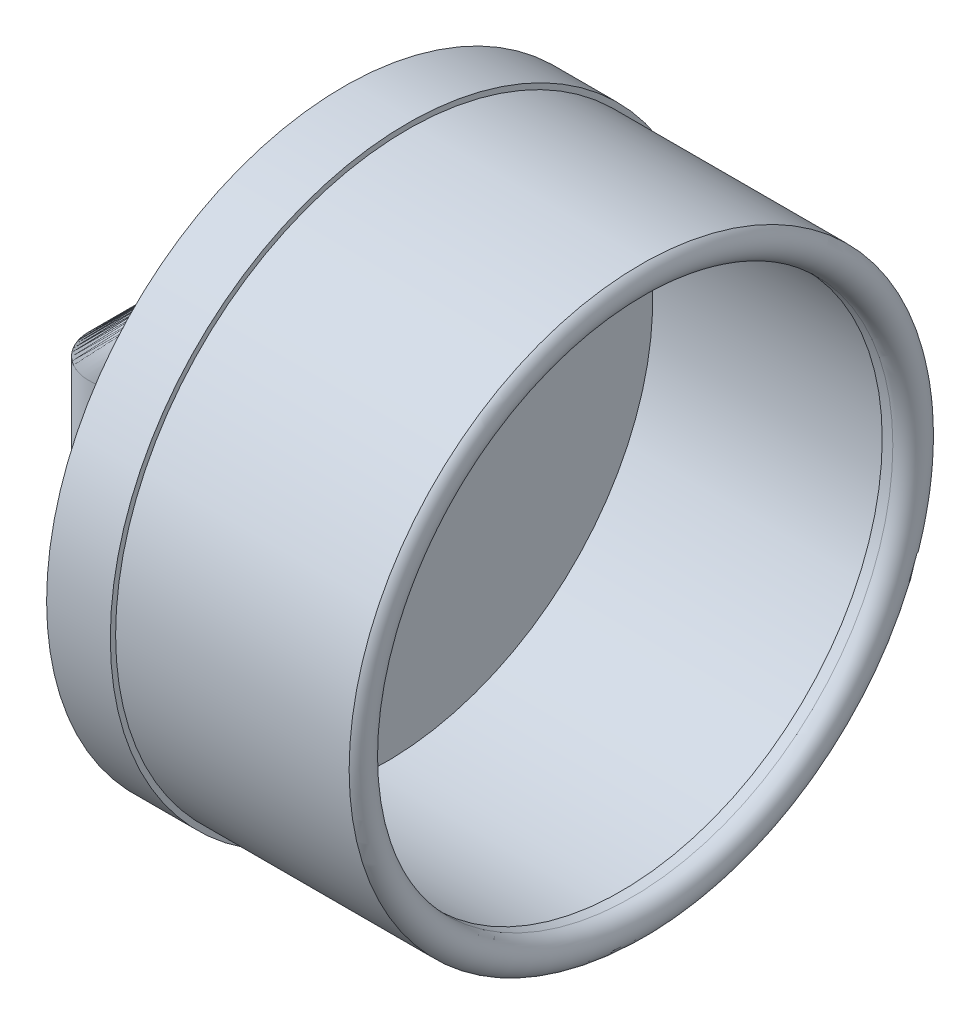
ISO-10303-21;
HEADER;
FILE_DESCRIPTION(('STEP AP214'),'2;1');
FILE_NAME('part.step','',(''),(''),'','','');
FILE_SCHEMA(('AUTOMOTIVE_DESIGN { 1 0 10303 214 1 1 1 1 }'));
ENDSEC;
DATA;
#1=APPLICATION_CONTEXT('core data for automotive mechanical design processes');
#2=APPLICATION_PROTOCOL_DEFINITION('international standard','automotive_design',2000,#1);
#3=PRODUCT_CONTEXT('',#1,'mechanical');
#4=PRODUCT('Part','Part','',(#3));
#5=PRODUCT_RELATED_PRODUCT_CATEGORY('part','',(#4));
#6=PRODUCT_DEFINITION_FORMATION('','',#4);
#7=PRODUCT_DEFINITION_CONTEXT('part definition',#1,'design');
#8=PRODUCT_DEFINITION('design','',#6,#7);
#9=PRODUCT_DEFINITION_SHAPE('','',#8);
#10=(LENGTH_UNIT() NAMED_UNIT(*) SI_UNIT(.MILLI.,.METRE.));
#11=(NAMED_UNIT(*) PLANE_ANGLE_UNIT() SI_UNIT($,.RADIAN.));
#12=(NAMED_UNIT(*) SI_UNIT($,.STERADIAN.) SOLID_ANGLE_UNIT());
#13=UNCERTAINTY_MEASURE_WITH_UNIT(LENGTH_MEASURE(1.E-05),#10,'distance_accuracy_value','');
#14=(GEOMETRIC_REPRESENTATION_CONTEXT(3) GLOBAL_UNCERTAINTY_ASSIGNED_CONTEXT((#13)) GLOBAL_UNIT_ASSIGNED_CONTEXT((#10,
#11,#12)) REPRESENTATION_CONTEXT('',''));
#15=CARTESIAN_POINT('',(0.,0.,0.));
#16=DIRECTION('',(0.,0.,1.));
#17=DIRECTION('',(1.,0.,0.));
#18=AXIS2_PLACEMENT_3D('',#15,#16,#17);
#19=CARTESIAN_POINT('',(12.1757416936097,-8.53326323507829,0.));
#20=DIRECTION('',(-1.,0.,0.));
#21=DIRECTION('',(0.,0.,1.));
#22=AXIS2_PLACEMENT_3D('',#19,#20,#21);
#23=CYLINDRICAL_SURFACE('',#22,12.3);
#24=CARTESIAN_POINT('',(11.9728126653829,-8.53326323507829,0.));
#25=DIRECTION('',(-1.,0.,0.));
#26=DIRECTION('',(0.,0.,1.));
#27=AXIS2_PLACEMENT_3D('',#24,#25,#26);
#28=CIRCLE('',#27,12.3);
#29=CARTESIAN_POINT('',(11.9728126653829,-8.53326323507829,12.3));
#30=VERTEX_POINT('',#29);
#31=EDGE_CURVE('E42',#30,#30,#28,.T.);
#32=ORIENTED_EDGE('',*,*,#31,.T.);
#33=EDGE_LOOP('',(#32));
#34=FACE_BOUND('',#33,.T.);
#35=CARTESIAN_POINT('',(12.4728126653829,-8.53326323507829,0.));
#36=DIRECTION('',(-1.,0.,0.));
#37=DIRECTION('',(0.,0.,1.));
#38=AXIS2_PLACEMENT_3D('',#35,#36,#37);
#39=CIRCLE('',#38,12.3);
#40=CARTESIAN_POINT('',(12.4728126653829,-8.53326323507829,12.3));
#41=VERTEX_POINT('',#40);
#42=EDGE_CURVE('E68',#41,#41,#39,.T.);
#43=ORIENTED_EDGE('',*,*,#42,.F.);
#44=EDGE_LOOP('',(#43));
#45=FACE_BOUND('',#44,.T.);
#46=ADVANCED_FACE('F35',(#34,#45),#23,.F.);
#47=CARTESIAN_POINT('',(11.9728126653829,3.76673676492171,0.));
#48=DIRECTION('',(-1.,0.,0.));
#49=DIRECTION('',(0.,0.,1.));
#50=AXIS2_PLACEMENT_3D('',#47,#48,#49);
#51=PLANE('',#50);
#52=CARTESIAN_POINT('',(11.9728126653829,-8.53326323507829,0.));
#53=DIRECTION('',(-1.,0.,0.));
#54=DIRECTION('',(0.,0.,1.));
#55=AXIS2_PLACEMENT_3D('',#52,#53,#54);
#56=CIRCLE('',#55,12.55);
#57=CARTESIAN_POINT('',(11.9728126653829,-8.53326323507829,12.55));
#58=VERTEX_POINT('',#57);
#59=EDGE_CURVE('E80',#58,#58,#56,.T.);
#60=ORIENTED_EDGE('',*,*,#59,.T.);
#61=EDGE_LOOP('',(#60));
#62=FACE_BOUND('',#61,.T.);
#63=ORIENTED_EDGE('',*,*,#31,.F.);
#64=EDGE_LOOP('',(#63));
#65=FACE_BOUND('',#64,.T.);
#66=ADVANCED_FACE('F87',(#62,#65),#51,.T.);
#67=CARTESIAN_POINT('',(12.1757416936097,-8.53326323507829,0.));
#68=DIRECTION('',(-1.,0.,0.));
#69=DIRECTION('',(0.,0.,1.));
#70=AXIS2_PLACEMENT_3D('',#67,#68,#69);
#71=CYLINDRICAL_SURFACE('',#70,12.55);
#72=CARTESIAN_POINT('',(0.912123334161097,-8.53326323507829,0.));
#73=DIRECTION('',(-1.,0.,0.));
#74=DIRECTION('',(0.,0.,1.));
#75=AXIS2_PLACEMENT_3D('',#72,#73,#74);
#76=CIRCLE('',#75,12.55);
#77=CARTESIAN_POINT('',(0.912123334161097,-8.53326323507829,12.55));
#78=VERTEX_POINT('',#77);
#79=EDGE_CURVE('E65',#78,#78,#76,.T.);
#80=ORIENTED_EDGE('',*,*,#79,.T.);
#81=EDGE_LOOP('',(#80));
#82=FACE_BOUND('',#81,.T.);
#83=ORIENTED_EDGE('',*,*,#59,.F.);
#84=EDGE_LOOP('',(#83));
#85=FACE_BOUND('',#84,.T.);
#86=ADVANCED_FACE('F89',(#82,#85),#71,.F.);
#87=CARTESIAN_POINT('',(12.1757416936097,-8.53326323507829,0.));
#88=DIRECTION('',(-1.,0.,0.));
#89=DIRECTION('',(0.,0.,1.));
#90=AXIS2_PLACEMENT_3D('',#87,#88,#89);
#91=CYLINDRICAL_SURFACE('',#90,14.);
#92=CARTESIAN_POINT('',(1.9121233341611,-8.53326323507829,0.));
#93=DIRECTION('',(-1.,0.,0.));
#94=DIRECTION('',(0.,0.,1.));
#95=AXIS2_PLACEMENT_3D('',#92,#93,#94);
#96=CIRCLE('',#95,14.);
#97=CARTESIAN_POINT('',(1.9121233341611,-8.53326323507829,14.));
#98=VERTEX_POINT('',#97);
#99=EDGE_CURVE('E77',#98,#98,#96,.T.);
#100=ORIENTED_EDGE('',*,*,#99,.T.);
#101=EDGE_LOOP('',(#100));
#102=FACE_BOUND('',#101,.T.);
#103=CARTESIAN_POINT('',(-1.0878766658389,-8.53326323507829,0.));
#104=DIRECTION('',(-1.,0.,0.));
#105=DIRECTION('',(0.,0.,1.));
#106=AXIS2_PLACEMENT_3D('',#103,#104,#105);
#107=CIRCLE('',#106,14.);
#108=CARTESIAN_POINT('',(-1.0878766658389,-8.53326323507829,14.));
#109=VERTEX_POINT('',#108);
#110=EDGE_CURVE('E62',#109,#109,#107,.T.);
#111=ORIENTED_EDGE('',*,*,#110,.F.);
#112=EDGE_LOOP('',(#111));
#113=FACE_BOUND('',#112,.T.);
#114=ADVANCED_FACE('F95',(#102,#113),#91,.T.);
#115=CARTESIAN_POINT('',(1.9121233341611,5.46673676492171,0.));
#116=DIRECTION('',(1.,0.,0.));
#117=DIRECTION('',(0.,0.,-1.));
#118=AXIS2_PLACEMENT_3D('',#115,#116,#117);
#119=PLANE('',#118);
#120=CARTESIAN_POINT('',(1.9121233341611,-8.53326323507829,0.));
#121=DIRECTION('',(-1.,0.,0.));
#122=DIRECTION('',(0.,0.,1.));
#123=AXIS2_PLACEMENT_3D('',#120,#121,#122);
#124=CIRCLE('',#123,13.75);
#125=CARTESIAN_POINT('',(1.9121233341611,-8.53326323507829,13.75));
#126=VERTEX_POINT('',#125);
#127=EDGE_CURVE('E74',#126,#126,#124,.T.);
#128=ORIENTED_EDGE('',*,*,#127,.T.);
#129=EDGE_LOOP('',(#128));
#130=FACE_BOUND('',#129,.T.);
#131=ORIENTED_EDGE('',*,*,#99,.F.);
#132=EDGE_LOOP('',(#131));
#133=FACE_BOUND('',#132,.T.);
#134=ADVANCED_FACE('F101',(#130,#133),#119,.T.);
#135=CARTESIAN_POINT('',(12.1757416936097,-8.53326323507829,0.));
#136=DIRECTION('',(-1.,0.,0.));
#137=DIRECTION('',(0.,0.,1.));
#138=AXIS2_PLACEMENT_3D('',#135,#136,#137);
#139=CYLINDRICAL_SURFACE('',#138,13.75);
#140=CARTESIAN_POINT('',(12.9121233341611,-8.53326323507829,0.));
#141=DIRECTION('',(-1.,0.,0.));
#142=DIRECTION('',(0.,0.,1.));
#143=AXIS2_PLACEMENT_3D('',#140,#141,#142);
#144=CIRCLE('',#143,13.75);
#145=CARTESIAN_POINT('',(12.9121233341611,-8.53326323507829,13.75));
#146=VERTEX_POINT('',#145);
#147=EDGE_CURVE('E71',#146,#146,#144,.T.);
#148=ORIENTED_EDGE('',*,*,#147,.T.);
#149=EDGE_LOOP('',(#148));
#150=FACE_BOUND('',#149,.T.);
#151=ORIENTED_EDGE('',*,*,#127,.F.);
#152=EDGE_LOOP('',(#151));
#153=FACE_BOUND('',#152,.T.);
#154=ADVANCED_FACE('F105',(#150,#153),#139,.T.);
#155=CARTESIAN_POINT('',(12.4728126653829,-8.53326323507829,0.));
#156=DIRECTION('',(-1.,0.,0.));
#157=DIRECTION('',(0.,0.,1.));
#158=AXIS2_PLACEMENT_3D('',#155,#156,#157);
#159=TOROIDAL_SURFACE('',#158,13.0915496081732,0.791549608173223);
#160=ORIENTED_EDGE('',*,*,#42,.T.);
#161=EDGE_LOOP('',(#160));
#162=FACE_BOUND('',#161,.T.);
#163=ORIENTED_EDGE('',*,*,#147,.F.);
#164=EDGE_LOOP('',(#163));
#165=FACE_BOUND('',#164,.T.);
#166=ADVANCED_FACE('F109',(#162,#165),#159,.T.);
#167=CARTESIAN_POINT('',(-1.0878766658389,-8.53326323507829,0.));
#168=DIRECTION('',(-1.,0.,0.));
#169=DIRECTION('',(0.,0.,1.));
#170=AXIS2_PLACEMENT_3D('',#167,#168,#169);
#171=PLANE('',#170);
#172=CARTESIAN_POINT('',(-1.0878766658389,-8.53326323507829,0.));
#173=DIRECTION('',(-1.,0.,0.));
#174=DIRECTION('',(0.,0.,1.));
#175=AXIS2_PLACEMENT_3D('',#172,#173,#174);
#176=CIRCLE('',#175,2.);
#177=CARTESIAN_POINT('',(-1.0878766658389,-8.53326323507829,2.));
#178=VERTEX_POINT('',#177);
#179=EDGE_CURVE('E11',#178,#178,#176,.T.);
#180=ORIENTED_EDGE('',*,*,#179,.F.);
#181=EDGE_LOOP('',(#180));
#182=FACE_BOUND('',#181,.T.);
#183=ORIENTED_EDGE('',*,*,#110,.T.);
#184=EDGE_LOOP('',(#183));
#185=FACE_BOUND('',#184,.T.);
#186=ADVANCED_FACE('F113',(#182,#185),#171,.T.);
#187=CARTESIAN_POINT('',(0.912123334161096,-8.53326323507829,0.));
#188=DIRECTION('',(-1.,0.,0.));
#189=DIRECTION('',(0.,0.,1.));
#190=AXIS2_PLACEMENT_3D('',#187,#188,#189);
#191=PLANE('',#190);
#192=ORIENTED_EDGE('',*,*,#79,.F.);
#193=EDGE_LOOP('',(#192));
#194=FACE_BOUND('',#193,.T.);
#195=ADVANCED_FACE('F115',(#194),#191,.F.);
#196=CARTESIAN_POINT('',(-11.0878766658389,-17.5332632350783,0.));
#197=DIRECTION('',(0.,-1.,0.));
#198=DIRECTION('',(0.,0.,1.));
#199=AXIS2_PLACEMENT_3D('',#196,#197,#198);
#200=PLANE('',#199);
#201=CARTESIAN_POINT('',(-11.0878766658389,-17.5332632350783,0.));
#202=DIRECTION('',(0.,-1.,0.));
#203=DIRECTION('',(0.,0.,1.));
#204=AXIS2_PLACEMENT_3D('',#201,#202,#203);
#205=CIRCLE('',#204,2.);
#206=CARTESIAN_POINT('',(-11.0878766658389,-17.5332632350783,2.));
#207=VERTEX_POINT('',#206);
#208=EDGE_CURVE('E47',#207,#207,#205,.T.);
#209=ORIENTED_EDGE('',*,*,#208,.T.);
#210=EDGE_LOOP('',(#209));
#211=FACE_BOUND('',#210,.T.);
#212=ADVANCED_FACE('F118',(#211),#200,.T.);
#213=CARTESIAN_POINT('',(-1.0878766658389,-8.53326323507829,0.));
#214=DIRECTION('',(-1.,0.,0.));
#215=DIRECTION('',(0.,0.,1.));
#216=AXIS2_PLACEMENT_3D('',#213,#214,#215);
#217=CYLINDRICAL_SURFACE('',#216,2.);
#218=CARTESIAN_POINT('',(-9.0878766658389,-8.53326323507829,0.));
#219=DIRECTION('',(-1.,0.,0.));
#220=DIRECTION('',(0.,0.,1.));
#221=AXIS2_PLACEMENT_3D('',#218,#219,#220);
#222=CIRCLE('',#221,2.);
#223=CARTESIAN_POINT('',(-9.08787666583891,-10.5332632350783,0.));
#224=VERTEX_POINT('',#223);
#225=EDGE_CURVE('E51',#224,#224,#222,.T.);
#226=ORIENTED_EDGE('',*,*,#225,.F.);
#227=EDGE_LOOP('',(#226));
#228=FACE_BOUND('',#227,.T.);
#229=ORIENTED_EDGE('',*,*,#179,.T.);
#230=EDGE_LOOP('',(#229));
#231=FACE_BOUND('',#230,.T.);
#232=ADVANCED_FACE('F52',(#228,#231),#217,.T.);
#233=CARTESIAN_POINT('',(-9.08787666583891,-10.5332632350783,0.));
#234=DIRECTION('',(0.,0.,1.));
#235=DIRECTION('',(1.,0.,0.));
#236=AXIS2_PLACEMENT_3D('',#233,#234,#235);
#237=TOROIDAL_SURFACE('',#236,2.,2.);
#238=CARTESIAN_POINT('',(-11.0878766658389,-10.5332632350783,0.));
#239=DIRECTION('',(0.,-1.,0.));
#240=DIRECTION('',(0.,0.,1.));
#241=AXIS2_PLACEMENT_3D('',#238,#239,#240);
#242=CIRCLE('',#241,2.);
#243=EDGE_CURVE('E57',#224,#224,#242,.T.);
#244=ORIENTED_EDGE('',*,*,#243,.F.);
#245=ORIENTED_EDGE('',*,*,#225,.T.);
#246=EDGE_LOOP('',(#244,#245));
#247=FACE_BOUND('',#246,.T.);
#248=ADVANCED_FACE('F128',(#247),#237,.T.);
#249=CARTESIAN_POINT('',(-11.0878766658389,-10.5332632350783,0.));
#250=DIRECTION('',(0.,-1.,0.));
#251=DIRECTION('',(0.,0.,-1.));
#252=AXIS2_PLACEMENT_3D('',#249,#250,#251);
#253=CYLINDRICAL_SURFACE('',#252,2.);
#254=ORIENTED_EDGE('',*,*,#208,.F.);
#255=EDGE_LOOP('',(#254));
#256=FACE_BOUND('',#255,.T.);
#257=ORIENTED_EDGE('',*,*,#243,.T.);
#258=EDGE_LOOP('',(#257));
#259=FACE_BOUND('',#258,.T.);
#260=ADVANCED_FACE('F120',(#256,#259),#253,.T.);
#261=CLOSED_SHELL('',(#46,#66,#86,#114,#134,#154,#166,#186,#195,#212,#232,#248,#260));
#262=MANIFOLD_SOLID_BREP('B2',#261);
#263=ADVANCED_BREP_SHAPE_REPRESENTATION('',(#18,#262),#14);
#264=SHAPE_DEFINITION_REPRESENTATION(#9,#263);
ENDSEC;
END-ISO-10303-21;
